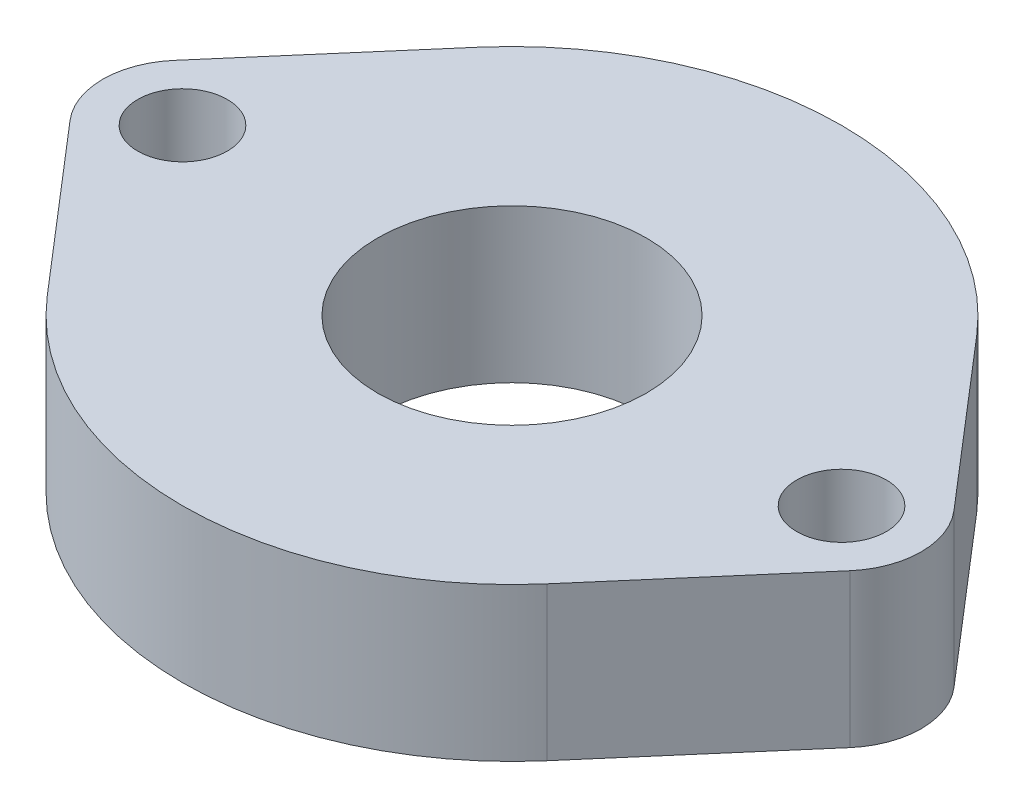
ISO-10303-21;
HEADER;
FILE_DESCRIPTION(('STEP AP214'),'2;1');
FILE_NAME('part.step','',(''),(''),'','','');
FILE_SCHEMA(('AUTOMOTIVE_DESIGN { 1 0 10303 214 1 1 1 1 }'));
ENDSEC;
DATA;
#1=APPLICATION_CONTEXT('core data for automotive mechanical design processes');
#2=APPLICATION_PROTOCOL_DEFINITION('international standard','automotive_design',2000,#1);
#3=PRODUCT_CONTEXT('',#1,'mechanical');
#4=PRODUCT('Part','Part','',(#3));
#5=PRODUCT_RELATED_PRODUCT_CATEGORY('part','',(#4));
#6=PRODUCT_DEFINITION_FORMATION('','',#4);
#7=PRODUCT_DEFINITION_CONTEXT('part definition',#1,'design');
#8=PRODUCT_DEFINITION('design','',#6,#7);
#9=PRODUCT_DEFINITION_SHAPE('','',#8);
#10=(LENGTH_UNIT() NAMED_UNIT(*) SI_UNIT(.MILLI.,.METRE.));
#11=(NAMED_UNIT(*) PLANE_ANGLE_UNIT() SI_UNIT($,.RADIAN.));
#12=(NAMED_UNIT(*) SI_UNIT($,.STERADIAN.) SOLID_ANGLE_UNIT());
#13=UNCERTAINTY_MEASURE_WITH_UNIT(LENGTH_MEASURE(1.E-05),#10,'distance_accuracy_value','');
#14=(GEOMETRIC_REPRESENTATION_CONTEXT(3) GLOBAL_UNCERTAINTY_ASSIGNED_CONTEXT((#13)) GLOBAL_UNIT_ASSIGNED_CONTEXT((#10,
#11,#12)) REPRESENTATION_CONTEXT('',''));
#15=CARTESIAN_POINT('',(0.,0.,0.));
#16=DIRECTION('',(0.,0.,1.));
#17=DIRECTION('',(1.,0.,0.));
#18=AXIS2_PLACEMENT_3D('',#15,#16,#17);
#19=CARTESIAN_POINT('',(-12.7,5.9055,0.));
#20=DIRECTION('',(0.,1.,0.));
#21=DIRECTION('',(0.,0.,1.));
#22=AXIS2_PLACEMENT_3D('',#19,#20,#21);
#23=PLANE('',#22);
#24=CARTESIAN_POINT('',(0.,5.9055,0.));
#25=DIRECTION('',(0.,1.,0.));
#26=DIRECTION('',(0.,0.,1.));
#27=AXIS2_PLACEMENT_3D('',#24,#25,#26);
#28=CIRCLE('',#27,5.1816);
#29=CARTESIAN_POINT('',(0.,5.9055,5.1816));
#30=VERTEX_POINT('',#29);
#31=EDGE_CURVE('E197',#30,#30,#28,.T.);
#32=ORIENTED_EDGE('',*,*,#31,.F.);
#33=EDGE_LOOP('',(#32));
#34=FACE_BOUND('',#33,.T.);
#35=CARTESIAN_POINT('',(-12.7,5.9055,0.));
#36=DIRECTION('',(0.,1.,0.));
#37=DIRECTION('',(0.,0.,1.));
#38=AXIS2_PLACEMENT_3D('',#35,#36,#37);
#39=CIRCLE('',#38,1.7272);
#40=CARTESIAN_POINT('',(-12.7,5.9055,1.7272));
#41=VERTEX_POINT('',#40);
#42=EDGE_CURVE('E140',#41,#41,#39,.T.);
#43=ORIENTED_EDGE('',*,*,#42,.F.);
#44=EDGE_LOOP('',(#43));
#45=FACE_BOUND('',#44,.T.);
#46=CARTESIAN_POINT('',(-12.7,5.9055,0.));
#47=DIRECTION('',(0.,1.,0.));
#48=DIRECTION('',(0.,0.,1.));
#49=AXIS2_PLACEMENT_3D('',#46,#47,#48);
#50=CIRCLE('',#49,3.0734);
#51=CARTESIAN_POINT('',(-15.0296372,5.9055,-2.00463913869209));
#52=VERTEX_POINT('',#51);
#53=CARTESIAN_POINT('',(-15.0296372,5.9055,2.00463913869209));
#54=VERTEX_POINT('',#53);
#55=EDGE_CURVE('E151',#52,#54,#50,.T.);
#56=ORIENTED_EDGE('',*,*,#55,.T.);
#57=DIRECTION('',(0.652254551536438,0.,0.758));
#58=VECTOR('',#57,1.);
#59=CARTESIAN_POINT('',(-15.0296372,5.9055,2.00463913869209));
#60=LINE('',#59,#58);
#61=CARTESIAN_POINT('',(-9.62660000000001,5.9055,8.28363280451276));
#62=VERTEX_POINT('',#61);
#63=EDGE_CURVE('E99',#54,#62,#60,.T.);
#64=ORIENTED_EDGE('',*,*,#63,.T.);
#65=CARTESIAN_POINT('',(0.,5.9055,0.));
#66=DIRECTION('',(0.,1.,0.));
#67=DIRECTION('',(0.,0.,1.));
#68=AXIS2_PLACEMENT_3D('',#65,#66,#67);
#69=CIRCLE('',#68,12.7);
#70=CARTESIAN_POINT('',(9.6266,5.9055,8.28363280451276));
#71=VERTEX_POINT('',#70);
#72=EDGE_CURVE('E166',#62,#71,#69,.T.);
#73=ORIENTED_EDGE('',*,*,#72,.T.);
#74=DIRECTION('',(0.652254551536438,0.,-0.758));
#75=VECTOR('',#74,1.);
#76=CARTESIAN_POINT('',(15.0296372,5.9055,2.00463913869209));
#77=LINE('',#76,#75);
#78=CARTESIAN_POINT('',(15.0296372,5.9055,2.00463913869209));
#79=VERTEX_POINT('',#78);
#80=EDGE_CURVE('E179',#71,#79,#77,.T.);
#81=ORIENTED_EDGE('',*,*,#80,.T.);
#82=CARTESIAN_POINT('',(12.7,5.9055,0.));
#83=DIRECTION('',(0.,1.,0.));
#84=DIRECTION('',(0.,0.,1.));
#85=AXIS2_PLACEMENT_3D('',#82,#83,#84);
#86=CIRCLE('',#85,3.0734);
#87=CARTESIAN_POINT('',(15.0296372,5.9055,-2.00463913869209));
#88=VERTEX_POINT('',#87);
#89=EDGE_CURVE('E118',#79,#88,#86,.T.);
#90=ORIENTED_EDGE('',*,*,#89,.T.);
#91=DIRECTION('',(-0.652254551536438,0.,-0.758));
#92=VECTOR('',#91,1.);
#93=CARTESIAN_POINT('',(9.6266,5.9055,-8.28363280451276));
#94=LINE('',#93,#92);
#95=CARTESIAN_POINT('',(9.6266,5.9055,-8.28363280451276));
#96=VERTEX_POINT('',#95);
#97=EDGE_CURVE('E112',#88,#96,#94,.T.);
#98=ORIENTED_EDGE('',*,*,#97,.T.);
#99=CARTESIAN_POINT('',(0.,5.9055,0.));
#100=DIRECTION('',(0.,1.,0.));
#101=DIRECTION('',(0.,0.,1.));
#102=AXIS2_PLACEMENT_3D('',#99,#100,#101);
#103=CIRCLE('',#102,12.7);
#104=CARTESIAN_POINT('',(-9.6266,5.9055,-8.28363280451276));
#105=VERTEX_POINT('',#104);
#106=EDGE_CURVE('E116',#96,#105,#103,.T.);
#107=ORIENTED_EDGE('',*,*,#106,.T.);
#108=DIRECTION('',(-0.652254551536438,0.,0.758));
#109=VECTOR('',#108,1.);
#110=CARTESIAN_POINT('',(-15.0296372,5.9055,-2.00463913869209));
#111=LINE('',#110,#109);
#112=EDGE_CURVE('E56',#105,#52,#111,.T.);
#113=ORIENTED_EDGE('',*,*,#112,.T.);
#114=EDGE_LOOP('',(#56,#64,#73,#81,#90,#98,#107,#113));
#115=FACE_BOUND('',#114,.T.);
#116=CARTESIAN_POINT('',(12.7,5.9055,0.));
#117=DIRECTION('',(0.,1.,0.));
#118=DIRECTION('',(0.,0.,1.));
#119=AXIS2_PLACEMENT_3D('',#116,#117,#118);
#120=CIRCLE('',#119,1.7272);
#121=CARTESIAN_POINT('',(12.7,5.9055,1.7272));
#122=VERTEX_POINT('',#121);
#123=EDGE_CURVE('E188',#122,#122,#120,.T.);
#124=ORIENTED_EDGE('',*,*,#123,.F.);
#125=EDGE_LOOP('',(#124));
#126=FACE_BOUND('',#125,.T.);
#127=ADVANCED_FACE('F39',(#34,#45,#115,#126),#23,.T.);
#128=CARTESIAN_POINT('',(-12.7,0.,0.));
#129=DIRECTION('',(0.,1.,0.));
#130=DIRECTION('',(0.,0.,1.));
#131=AXIS2_PLACEMENT_3D('',#128,#129,#130);
#132=PLANE('',#131);
#133=CARTESIAN_POINT('',(0.,0.,0.));
#134=DIRECTION('',(0.,1.,0.));
#135=DIRECTION('',(0.,0.,1.));
#136=AXIS2_PLACEMENT_3D('',#133,#134,#135);
#137=CIRCLE('',#136,5.1816);
#138=CARTESIAN_POINT('',(0.,0.,5.1816));
#139=VERTEX_POINT('',#138);
#140=EDGE_CURVE('E194',#139,#139,#137,.T.);
#141=ORIENTED_EDGE('',*,*,#140,.T.);
#142=EDGE_LOOP('',(#141));
#143=FACE_BOUND('',#142,.T.);
#144=CARTESIAN_POINT('',(-12.7,0.,0.));
#145=DIRECTION('',(0.,1.,0.));
#146=DIRECTION('',(0.,0.,1.));
#147=AXIS2_PLACEMENT_3D('',#144,#145,#146);
#148=CIRCLE('',#147,3.0734);
#149=CARTESIAN_POINT('',(-15.0296372,0.,-2.00463913869209));
#150=VERTEX_POINT('',#149);
#151=CARTESIAN_POINT('',(-15.0296372,0.,2.00463913869209));
#152=VERTEX_POINT('',#151);
#153=EDGE_CURVE('E136',#150,#152,#148,.T.);
#154=ORIENTED_EDGE('',*,*,#153,.F.);
#155=DIRECTION('',(-0.652254551536438,0.,0.758));
#156=VECTOR('',#155,1.);
#157=CARTESIAN_POINT('',(-15.0296372,0.,-2.00463913869209));
#158=LINE('',#157,#156);
#159=CARTESIAN_POINT('',(-9.6266,0.,-8.28363280451276));
#160=VERTEX_POINT('',#159);
#161=EDGE_CURVE('E91',#160,#150,#158,.T.);
#162=ORIENTED_EDGE('',*,*,#161,.F.);
#163=CARTESIAN_POINT('',(0.,0.,0.));
#164=DIRECTION('',(0.,1.,0.));
#165=DIRECTION('',(0.,0.,1.));
#166=AXIS2_PLACEMENT_3D('',#163,#164,#165);
#167=CIRCLE('',#166,12.7);
#168=CARTESIAN_POINT('',(9.6266,0.,-8.28363280451276));
#169=VERTEX_POINT('',#168);
#170=EDGE_CURVE('E85',#169,#160,#167,.T.);
#171=ORIENTED_EDGE('',*,*,#170,.F.);
#172=DIRECTION('',(-0.652254551536438,0.,-0.758));
#173=VECTOR('',#172,1.);
#174=CARTESIAN_POINT('',(9.6266,0.,-8.28363280451276));
#175=LINE('',#174,#173);
#176=CARTESIAN_POINT('',(15.0296372,0.,-2.00463913869209));
#177=VERTEX_POINT('',#176);
#178=EDGE_CURVE('E126',#177,#169,#175,.T.);
#179=ORIENTED_EDGE('',*,*,#178,.F.);
#180=CARTESIAN_POINT('',(12.7,0.,0.));
#181=DIRECTION('',(0.,1.,0.));
#182=DIRECTION('',(0.,0.,1.));
#183=AXIS2_PLACEMENT_3D('',#180,#181,#182);
#184=CIRCLE('',#183,3.0734);
#185=CARTESIAN_POINT('',(15.0296372,0.,2.00463913869209));
#186=VERTEX_POINT('',#185);
#187=EDGE_CURVE('E146',#186,#177,#184,.T.);
#188=ORIENTED_EDGE('',*,*,#187,.F.);
#189=DIRECTION('',(0.652254551536438,0.,-0.758));
#190=VECTOR('',#189,1.);
#191=CARTESIAN_POINT('',(15.0296372,0.,2.00463913869209));
#192=LINE('',#191,#190);
#193=CARTESIAN_POINT('',(9.6266,0.,8.28363280451276));
#194=VERTEX_POINT('',#193);
#195=EDGE_CURVE('E144',#194,#186,#192,.T.);
#196=ORIENTED_EDGE('',*,*,#195,.F.);
#197=CARTESIAN_POINT('',(0.,0.,0.));
#198=DIRECTION('',(0.,1.,0.));
#199=DIRECTION('',(0.,0.,1.));
#200=AXIS2_PLACEMENT_3D('',#197,#198,#199);
#201=CIRCLE('',#200,12.7);
#202=CARTESIAN_POINT('',(-9.62660000000001,0.,8.28363280451276));
#203=VERTEX_POINT('',#202);
#204=EDGE_CURVE('E142',#203,#194,#201,.T.);
#205=ORIENTED_EDGE('',*,*,#204,.F.);
#206=DIRECTION('',(0.652254551536438,0.,0.758));
#207=VECTOR('',#206,1.);
#208=CARTESIAN_POINT('',(-15.0296372,0.,2.00463913869209));
#209=LINE('',#208,#207);
#210=EDGE_CURVE('E139',#152,#203,#209,.T.);
#211=ORIENTED_EDGE('',*,*,#210,.F.);
#212=EDGE_LOOP('',(#154,#162,#171,#179,#188,#196,#205,#211));
#213=FACE_BOUND('',#212,.T.);
#214=CARTESIAN_POINT('',(-12.7,0.,0.));
#215=DIRECTION('',(0.,1.,0.));
#216=DIRECTION('',(0.,0.,1.));
#217=AXIS2_PLACEMENT_3D('',#214,#215,#216);
#218=CIRCLE('',#217,1.7272);
#219=CARTESIAN_POINT('',(-12.7,0.,1.7272));
#220=VERTEX_POINT('',#219);
#221=EDGE_CURVE('E185',#220,#220,#218,.T.);
#222=ORIENTED_EDGE('',*,*,#221,.T.);
#223=EDGE_LOOP('',(#222));
#224=FACE_BOUND('',#223,.T.);
#225=CARTESIAN_POINT('',(12.7,0.,0.));
#226=DIRECTION('',(0.,1.,0.));
#227=DIRECTION('',(0.,0.,1.));
#228=AXIS2_PLACEMENT_3D('',#225,#226,#227);
#229=CIRCLE('',#228,1.7272);
#230=CARTESIAN_POINT('',(12.7,0.,1.7272));
#231=VERTEX_POINT('',#230);
#232=EDGE_CURVE('E191',#231,#231,#229,.T.);
#233=ORIENTED_EDGE('',*,*,#232,.T.);
#234=EDGE_LOOP('',(#233));
#235=FACE_BOUND('',#234,.T.);
#236=ADVANCED_FACE('F170',(#143,#213,#224,#235),#132,.F.);
#237=CARTESIAN_POINT('',(-12.7,5.9055,0.));
#238=DIRECTION('',(0.,-1.,0.));
#239=DIRECTION('',(0.,0.,-1.));
#240=AXIS2_PLACEMENT_3D('',#237,#238,#239);
#241=CYLINDRICAL_SURFACE('',#240,3.0734);
#242=ORIENTED_EDGE('',*,*,#153,.T.);
#243=DIRECTION('',(0.,-1.,0.));
#244=VECTOR('',#243,1.);
#245=CARTESIAN_POINT('',(-15.0296372,5.9055,2.00463913869209));
#246=LINE('',#245,#244);
#247=EDGE_CURVE('E11',#54,#152,#246,.T.);
#248=ORIENTED_EDGE('',*,*,#247,.F.);
#249=ORIENTED_EDGE('',*,*,#55,.F.);
#250=DIRECTION('',(0.,-1.,0.));
#251=VECTOR('',#250,1.);
#252=CARTESIAN_POINT('',(-15.0296372,5.9055,-2.00463913869209));
#253=LINE('',#252,#251);
#254=EDGE_CURVE('E132',#52,#150,#253,.T.);
#255=ORIENTED_EDGE('',*,*,#254,.T.);
#256=EDGE_LOOP('',(#242,#248,#249,#255));
#257=FACE_BOUND('',#256,.T.);
#258=ADVANCED_FACE('F41',(#257),#241,.T.);
#259=CARTESIAN_POINT('',(-15.0296372,5.9055,2.00463913869209));
#260=DIRECTION('',(0.758,0.,-0.652254551536438));
#261=DIRECTION('',(-0.652254551536438,0.,-0.758));
#262=AXIS2_PLACEMENT_3D('',#259,#260,#261);
#263=PLANE('',#262);
#264=ORIENTED_EDGE('',*,*,#210,.T.);
#265=DIRECTION('',(0.,-1.,0.));
#266=VECTOR('',#265,1.);
#267=CARTESIAN_POINT('',(-9.62660000000001,5.9055,8.28363280451276));
#268=LINE('',#267,#266);
#269=EDGE_CURVE('E48',#62,#203,#268,.T.);
#270=ORIENTED_EDGE('',*,*,#269,.F.);
#271=ORIENTED_EDGE('',*,*,#63,.F.);
#272=ORIENTED_EDGE('',*,*,#247,.T.);
#273=EDGE_LOOP('',(#264,#270,#271,#272));
#274=FACE_BOUND('',#273,.T.);
#275=ADVANCED_FACE('F244',(#274),#263,.F.);
#276=CARTESIAN_POINT('',(0.,5.9055,0.));
#277=DIRECTION('',(0.,-1.,0.));
#278=DIRECTION('',(0.,0.,-1.));
#279=AXIS2_PLACEMENT_3D('',#276,#277,#278);
#280=CYLINDRICAL_SURFACE('',#279,12.7);
#281=ORIENTED_EDGE('',*,*,#204,.T.);
#282=DIRECTION('',(0.,-1.,0.));
#283=VECTOR('',#282,1.);
#284=CARTESIAN_POINT('',(9.6266,5.9055,8.28363280451276));
#285=LINE('',#284,#283);
#286=EDGE_CURVE('E158',#71,#194,#285,.T.);
#287=ORIENTED_EDGE('',*,*,#286,.F.);
#288=ORIENTED_EDGE('',*,*,#72,.F.);
#289=ORIENTED_EDGE('',*,*,#269,.T.);
#290=EDGE_LOOP('',(#281,#287,#288,#289));
#291=FACE_BOUND('',#290,.T.);
#292=ADVANCED_FACE('F164',(#291),#280,.T.);
#293=CARTESIAN_POINT('',(15.0296372,5.9055,2.00463913869209));
#294=DIRECTION('',(-0.758,0.,-0.652254551536438));
#295=DIRECTION('',(-0.652254551536438,0.,0.758));
#296=AXIS2_PLACEMENT_3D('',#293,#294,#295);
#297=PLANE('',#296);
#298=ORIENTED_EDGE('',*,*,#195,.T.);
#299=DIRECTION('',(0.,-1.,0.));
#300=VECTOR('',#299,1.);
#301=CARTESIAN_POINT('',(15.0296372,5.9055,2.00463913869209));
#302=LINE('',#301,#300);
#303=EDGE_CURVE('E155',#79,#186,#302,.T.);
#304=ORIENTED_EDGE('',*,*,#303,.F.);
#305=ORIENTED_EDGE('',*,*,#80,.F.);
#306=ORIENTED_EDGE('',*,*,#286,.T.);
#307=EDGE_LOOP('',(#298,#304,#305,#306));
#308=FACE_BOUND('',#307,.T.);
#309=ADVANCED_FACE('F175',(#308),#297,.F.);
#310=CARTESIAN_POINT('',(12.7,5.9055,0.));
#311=DIRECTION('',(0.,-1.,0.));
#312=DIRECTION('',(0.,0.,-1.));
#313=AXIS2_PLACEMENT_3D('',#310,#311,#312);
#314=CYLINDRICAL_SURFACE('',#313,3.0734);
#315=ORIENTED_EDGE('',*,*,#187,.T.);
#316=DIRECTION('',(0.,-1.,0.));
#317=VECTOR('',#316,1.);
#318=CARTESIAN_POINT('',(15.0296372,5.9055,-2.00463913869209));
#319=LINE('',#318,#317);
#320=EDGE_CURVE('E127',#88,#177,#319,.T.);
#321=ORIENTED_EDGE('',*,*,#320,.F.);
#322=ORIENTED_EDGE('',*,*,#89,.F.);
#323=ORIENTED_EDGE('',*,*,#303,.T.);
#324=EDGE_LOOP('',(#315,#321,#322,#323));
#325=FACE_BOUND('',#324,.T.);
#326=ADVANCED_FACE('F178',(#325),#314,.T.);
#327=CARTESIAN_POINT('',(9.6266,5.9055,-8.28363280451276));
#328=DIRECTION('',(-0.758,0.,0.652254551536438));
#329=DIRECTION('',(0.652254551536438,0.,0.758));
#330=AXIS2_PLACEMENT_3D('',#327,#328,#329);
#331=PLANE('',#330);
#332=ORIENTED_EDGE('',*,*,#178,.T.);
#333=DIRECTION('',(0.,-1.,0.));
#334=VECTOR('',#333,1.);
#335=CARTESIAN_POINT('',(9.6266,5.9055,-8.28363280451276));
#336=LINE('',#335,#334);
#337=EDGE_CURVE('E123',#96,#169,#336,.T.);
#338=ORIENTED_EDGE('',*,*,#337,.F.);
#339=ORIENTED_EDGE('',*,*,#97,.F.);
#340=ORIENTED_EDGE('',*,*,#320,.T.);
#341=EDGE_LOOP('',(#332,#338,#339,#340));
#342=FACE_BOUND('',#341,.T.);
#343=ADVANCED_FACE('F124',(#342),#331,.F.);
#344=CARTESIAN_POINT('',(0.,5.9055,0.));
#345=DIRECTION('',(0.,-1.,0.));
#346=DIRECTION('',(0.,0.,-1.));
#347=AXIS2_PLACEMENT_3D('',#344,#345,#346);
#348=CYLINDRICAL_SURFACE('',#347,12.7);
#349=ORIENTED_EDGE('',*,*,#170,.T.);
#350=DIRECTION('',(0.,-1.,0.));
#351=VECTOR('',#350,1.);
#352=CARTESIAN_POINT('',(-9.6266,5.9055,-8.28363280451276));
#353=LINE('',#352,#351);
#354=EDGE_CURVE('E128',#105,#160,#353,.T.);
#355=ORIENTED_EDGE('',*,*,#354,.F.);
#356=ORIENTED_EDGE('',*,*,#106,.F.);
#357=ORIENTED_EDGE('',*,*,#337,.T.);
#358=EDGE_LOOP('',(#349,#355,#356,#357));
#359=FACE_BOUND('',#358,.T.);
#360=ADVANCED_FACE('F130',(#359),#348,.T.);
#361=CARTESIAN_POINT('',(-15.0296372,5.9055,-2.00463913869209));
#362=DIRECTION('',(0.758,0.,0.652254551536438));
#363=DIRECTION('',(0.652254551536438,0.,-0.758));
#364=AXIS2_PLACEMENT_3D('',#361,#362,#363);
#365=PLANE('',#364);
#366=ORIENTED_EDGE('',*,*,#161,.T.);
#367=ORIENTED_EDGE('',*,*,#254,.F.);
#368=ORIENTED_EDGE('',*,*,#112,.F.);
#369=ORIENTED_EDGE('',*,*,#354,.T.);
#370=EDGE_LOOP('',(#366,#367,#368,#369));
#371=FACE_BOUND('',#370,.T.);
#372=ADVANCED_FACE('F219',(#371),#365,.F.);
#373=CARTESIAN_POINT('',(-12.7,5.9055,0.));
#374=DIRECTION('',(0.,-1.,0.));
#375=DIRECTION('',(0.,0.,-1.));
#376=AXIS2_PLACEMENT_3D('',#373,#374,#375);
#377=CYLINDRICAL_SURFACE('',#376,1.7272);
#378=ORIENTED_EDGE('',*,*,#42,.T.);
#379=EDGE_LOOP('',(#378));
#380=FACE_BOUND('',#379,.T.);
#381=ORIENTED_EDGE('',*,*,#221,.F.);
#382=EDGE_LOOP('',(#381));
#383=FACE_BOUND('',#382,.T.);
#384=ADVANCED_FACE('F216',(#380,#383),#377,.F.);
#385=CARTESIAN_POINT('',(12.7,5.9055,0.));
#386=DIRECTION('',(0.,-1.,0.));
#387=DIRECTION('',(0.,0.,-1.));
#388=AXIS2_PLACEMENT_3D('',#385,#386,#387);
#389=CYLINDRICAL_SURFACE('',#388,1.7272);
#390=ORIENTED_EDGE('',*,*,#123,.T.);
#391=EDGE_LOOP('',(#390));
#392=FACE_BOUND('',#391,.T.);
#393=ORIENTED_EDGE('',*,*,#232,.F.);
#394=EDGE_LOOP('',(#393));
#395=FACE_BOUND('',#394,.T.);
#396=ADVANCED_FACE('F207',(#392,#395),#389,.F.);
#397=CARTESIAN_POINT('',(0.,0.,0.));
#398=DIRECTION('',(0.,1.,0.));
#399=DIRECTION('',(0.,0.,1.));
#400=AXIS2_PLACEMENT_3D('',#397,#398,#399);
#401=CYLINDRICAL_SURFACE('',#400,5.1816);
#402=ORIENTED_EDGE('',*,*,#140,.F.);
#403=EDGE_LOOP('',(#402));
#404=FACE_BOUND('',#403,.T.);
#405=ORIENTED_EDGE('',*,*,#31,.T.);
#406=EDGE_LOOP('',(#405));
#407=FACE_BOUND('',#406,.T.);
#408=ADVANCED_FACE('F204',(#404,#407),#401,.F.);
#409=CLOSED_SHELL('',(#127,#236,#258,#275,#292,#309,#326,#343,#360,#372,#384,#396,#408));
#410=MANIFOLD_SOLID_BREP('B2',#409);
#411=ADVANCED_BREP_SHAPE_REPRESENTATION('',(#18,#410),#14);
#412=SHAPE_DEFINITION_REPRESENTATION(#9,#411);
ENDSEC;
END-ISO-10303-21;
